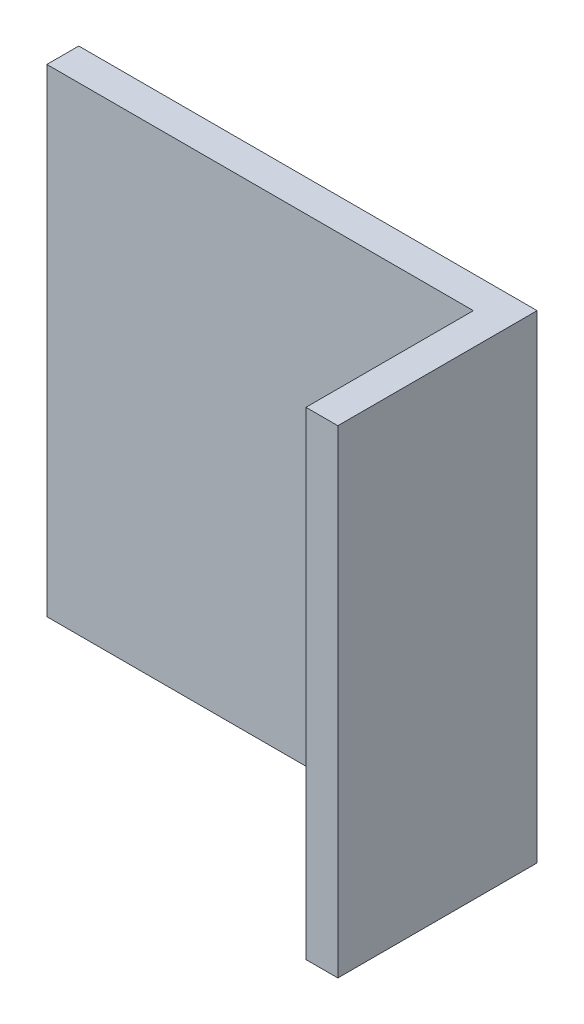
ISO-10303-21;
HEADER;
FILE_DESCRIPTION(('STEP AP214'),'2;1');
FILE_NAME('part.step','',(''),(''),'','','');
FILE_SCHEMA(('AUTOMOTIVE_DESIGN { 1 0 10303 214 1 1 1 1 }'));
ENDSEC;
DATA;
#1=APPLICATION_CONTEXT('core data for automotive mechanical design processes');
#2=APPLICATION_PROTOCOL_DEFINITION('international standard','automotive_design',2000,#1);
#3=PRODUCT_CONTEXT('',#1,'mechanical');
#4=PRODUCT('Part','Part','',(#3));
#5=PRODUCT_RELATED_PRODUCT_CATEGORY('part','',(#4));
#6=PRODUCT_DEFINITION_FORMATION('','',#4);
#7=PRODUCT_DEFINITION_CONTEXT('part definition',#1,'design');
#8=PRODUCT_DEFINITION('design','',#6,#7);
#9=PRODUCT_DEFINITION_SHAPE('','',#8);
#10=(LENGTH_UNIT() NAMED_UNIT(*) SI_UNIT(.MILLI.,.METRE.));
#11=(NAMED_UNIT(*) PLANE_ANGLE_UNIT() SI_UNIT($,.RADIAN.));
#12=(NAMED_UNIT(*) SI_UNIT($,.STERADIAN.) SOLID_ANGLE_UNIT());
#13=UNCERTAINTY_MEASURE_WITH_UNIT(LENGTH_MEASURE(1.E-05),#10,'distance_accuracy_value','');
#14=(GEOMETRIC_REPRESENTATION_CONTEXT(3) GLOBAL_UNCERTAINTY_ASSIGNED_CONTEXT((#13)) GLOBAL_UNIT_ASSIGNED_CONTEXT((#10,
#11,#12)) REPRESENTATION_CONTEXT('',''));
#15=CARTESIAN_POINT('',(0.,0.,0.));
#16=DIRECTION('',(0.,0.,1.));
#17=DIRECTION('',(1.,0.,0.));
#18=AXIS2_PLACEMENT_3D('',#15,#16,#17);
#19=CARTESIAN_POINT('',(-115.,-120.,16.));
#20=DIRECTION('',(1.,0.,0.));
#21=DIRECTION('',(0.,0.,-1.));
#22=AXIS2_PLACEMENT_3D('',#19,#20,#21);
#23=PLANE('',#22);
#24=DIRECTION('',(0.,-1.,0.));
#25=VECTOR('',#24,1.);
#26=CARTESIAN_POINT('',(-115.,-120.,0.));
#27=LINE('',#26,#25);
#28=CARTESIAN_POINT('',(-115.,120.,0.));
#29=VERTEX_POINT('',#28);
#30=CARTESIAN_POINT('',(-115.,-120.,0.));
#31=VERTEX_POINT('',#30);
#32=EDGE_CURVE('E94',#29,#31,#27,.T.);
#33=ORIENTED_EDGE('',*,*,#32,.T.);
#34=DIRECTION('',(0.,0.,-1.));
#35=VECTOR('',#34,1.);
#36=CARTESIAN_POINT('',(-115.,-120.,16.));
#37=LINE('',#36,#35);
#38=CARTESIAN_POINT('',(-115.,-120.,16.));
#39=VERTEX_POINT('',#38);
#40=EDGE_CURVE('E11',#39,#31,#37,.T.);
#41=ORIENTED_EDGE('',*,*,#40,.F.);
#42=DIRECTION('',(0.,-1.,0.));
#43=VECTOR('',#42,1.);
#44=CARTESIAN_POINT('',(-115.,-120.,16.));
#45=LINE('',#44,#43);
#46=CARTESIAN_POINT('',(-115.,120.,16.));
#47=VERTEX_POINT('',#46);
#48=EDGE_CURVE('E88',#47,#39,#45,.T.);
#49=ORIENTED_EDGE('',*,*,#48,.F.);
#50=DIRECTION('',(0.,0.,-1.));
#51=VECTOR('',#50,1.);
#52=CARTESIAN_POINT('',(-115.,120.,16.));
#53=LINE('',#52,#51);
#54=EDGE_CURVE('E79',#47,#29,#53,.T.);
#55=ORIENTED_EDGE('',*,*,#54,.T.);
#56=EDGE_LOOP('',(#33,#41,#49,#55));
#57=FACE_BOUND('',#56,.T.);
#58=ADVANCED_FACE('F36',(#57),#23,.F.);
#59=CARTESIAN_POINT('',(115.,-120.,16.));
#60=DIRECTION('',(0.,1.,0.));
#61=DIRECTION('',(-1.,0.,0.));
#62=AXIS2_PLACEMENT_3D('',#59,#60,#61);
#63=PLANE('',#62);
#64=DIRECTION('',(1.,0.,0.));
#65=VECTOR('',#64,1.);
#66=CARTESIAN_POINT('',(115.,-120.,0.));
#67=LINE('',#66,#65);
#68=CARTESIAN_POINT('',(115.,-120.,0.));
#69=VERTEX_POINT('',#68);
#70=EDGE_CURVE('E98',#31,#69,#67,.T.);
#71=ORIENTED_EDGE('',*,*,#70,.T.);
#72=DIRECTION('',(0.,0.,-1.));
#73=VECTOR('',#72,1.);
#74=CARTESIAN_POINT('',(115.,-120.,16.));
#75=LINE('',#74,#73);
#76=CARTESIAN_POINT('',(115.,-120.,100.));
#77=VERTEX_POINT('',#76);
#78=EDGE_CURVE('E44',#77,#69,#75,.T.);
#79=ORIENTED_EDGE('',*,*,#78,.F.);
#80=DIRECTION('',(1.,0.,0.));
#81=VECTOR('',#80,1.);
#82=CARTESIAN_POINT('',(115.,-120.,100.));
#83=LINE('',#82,#81);
#84=CARTESIAN_POINT('',(99.,-120.,100.));
#85=VERTEX_POINT('',#84);
#86=EDGE_CURVE('E119',#85,#77,#83,.T.);
#87=ORIENTED_EDGE('',*,*,#86,.F.);
#88=DIRECTION('',(0.,0.,-1.));
#89=VECTOR('',#88,1.);
#90=CARTESIAN_POINT('',(99.,-120.,100.));
#91=LINE('',#90,#89);
#92=CARTESIAN_POINT('',(99.,-120.,16.));
#93=VERTEX_POINT('',#92);
#94=EDGE_CURVE('E103',#85,#93,#91,.T.);
#95=ORIENTED_EDGE('',*,*,#94,.T.);
#96=DIRECTION('',(1.,0.,0.));
#97=VECTOR('',#96,1.);
#98=CARTESIAN_POINT('',(115.,-120.,16.));
#99=LINE('',#98,#97);
#100=EDGE_CURVE('E111',#39,#93,#99,.T.);
#101=ORIENTED_EDGE('',*,*,#100,.F.);
#102=ORIENTED_EDGE('',*,*,#40,.T.);
#103=EDGE_LOOP('',(#71,#79,#87,#95,#101,#102));
#104=FACE_BOUND('',#103,.T.);
#105=ADVANCED_FACE('F156',(#104),#63,.F.);
#106=CARTESIAN_POINT('',(115.,-120.,16.));
#107=DIRECTION('',(-1.,0.,0.));
#108=DIRECTION('',(0.,0.,1.));
#109=AXIS2_PLACEMENT_3D('',#106,#107,#108);
#110=PLANE('',#109);
#111=DIRECTION('',(0.,1.,0.));
#112=VECTOR('',#111,1.);
#113=CARTESIAN_POINT('',(115.,-120.,0.));
#114=LINE('',#113,#112);
#115=CARTESIAN_POINT('',(115.,120.,0.));
#116=VERTEX_POINT('',#115);
#117=EDGE_CURVE('E89',#69,#116,#114,.T.);
#118=ORIENTED_EDGE('',*,*,#117,.T.);
#119=DIRECTION('',(0.,0.,-1.));
#120=VECTOR('',#119,1.);
#121=CARTESIAN_POINT('',(115.,120.,16.));
#122=LINE('',#121,#120);
#123=CARTESIAN_POINT('',(115.,120.,100.));
#124=VERTEX_POINT('',#123);
#125=EDGE_CURVE('E83',#124,#116,#122,.T.);
#126=ORIENTED_EDGE('',*,*,#125,.F.);
#127=DIRECTION('',(0.,1.,0.));
#128=VECTOR('',#127,1.);
#129=CARTESIAN_POINT('',(115.,-120.,100.));
#130=LINE('',#129,#128);
#131=EDGE_CURVE('E122',#77,#124,#130,.T.);
#132=ORIENTED_EDGE('',*,*,#131,.F.);
#133=ORIENTED_EDGE('',*,*,#78,.T.);
#134=EDGE_LOOP('',(#118,#126,#132,#133));
#135=FACE_BOUND('',#134,.T.);
#136=ADVANCED_FACE('F148',(#135),#110,.F.);
#137=CARTESIAN_POINT('',(115.,120.,16.));
#138=DIRECTION('',(0.,-1.,0.));
#139=DIRECTION('',(1.,0.,0.));
#140=AXIS2_PLACEMENT_3D('',#137,#138,#139);
#141=PLANE('',#140);
#142=DIRECTION('',(-1.,0.,0.));
#143=VECTOR('',#142,1.);
#144=CARTESIAN_POINT('',(115.,120.,16.));
#145=LINE('',#144,#143);
#146=CARTESIAN_POINT('',(99.,120.,16.));
#147=VERTEX_POINT('',#146);
#148=EDGE_CURVE('E57',#147,#47,#145,.T.);
#149=ORIENTED_EDGE('',*,*,#148,.F.);
#150=DIRECTION('',(0.,0.,-1.));
#151=VECTOR('',#150,1.);
#152=CARTESIAN_POINT('',(99.,120.,100.));
#153=LINE('',#152,#151);
#154=CARTESIAN_POINT('',(99.,120.,100.));
#155=VERTEX_POINT('',#154);
#156=EDGE_CURVE('E99',#155,#147,#153,.T.);
#157=ORIENTED_EDGE('',*,*,#156,.F.);
#158=DIRECTION('',(-1.,0.,0.));
#159=VECTOR('',#158,1.);
#160=CARTESIAN_POINT('',(115.,120.,100.));
#161=LINE('',#160,#159);
#162=EDGE_CURVE('E136',#124,#155,#161,.T.);
#163=ORIENTED_EDGE('',*,*,#162,.F.);
#164=ORIENTED_EDGE('',*,*,#125,.T.);
#165=DIRECTION('',(-1.,0.,0.));
#166=VECTOR('',#165,1.);
#167=CARTESIAN_POINT('',(115.,120.,0.));
#168=LINE('',#167,#166);
#169=EDGE_CURVE('E76',#116,#29,#168,.T.);
#170=ORIENTED_EDGE('',*,*,#169,.T.);
#171=ORIENTED_EDGE('',*,*,#54,.F.);
#172=EDGE_LOOP('',(#149,#157,#163,#164,#170,#171));
#173=FACE_BOUND('',#172,.T.);
#174=ADVANCED_FACE('F78',(#173),#141,.F.);
#175=CARTESIAN_POINT('',(-115.,120.,16.));
#176=DIRECTION('',(0.,0.,1.));
#177=DIRECTION('',(1.,0.,0.));
#178=AXIS2_PLACEMENT_3D('',#175,#176,#177);
#179=PLANE('',#178);
#180=DIRECTION('',(0.,-1.,0.));
#181=VECTOR('',#180,1.);
#182=CARTESIAN_POINT('',(99.,-120.,16.));
#183=LINE('',#182,#181);
#184=EDGE_CURVE('E52',#147,#93,#183,.T.);
#185=ORIENTED_EDGE('',*,*,#184,.F.);
#186=ORIENTED_EDGE('',*,*,#148,.T.);
#187=ORIENTED_EDGE('',*,*,#48,.T.);
#188=ORIENTED_EDGE('',*,*,#100,.T.);
#189=EDGE_LOOP('',(#185,#186,#187,#188));
#190=FACE_BOUND('',#189,.T.);
#191=ADVANCED_FACE('F153',(#190),#179,.T.);
#192=CARTESIAN_POINT('',(-115.,120.,0.));
#193=DIRECTION('',(0.,0.,1.));
#194=DIRECTION('',(1.,0.,0.));
#195=AXIS2_PLACEMENT_3D('',#192,#193,#194);
#196=PLANE('',#195);
#197=ORIENTED_EDGE('',*,*,#117,.F.);
#198=ORIENTED_EDGE('',*,*,#70,.F.);
#199=ORIENTED_EDGE('',*,*,#32,.F.);
#200=ORIENTED_EDGE('',*,*,#169,.F.);
#201=EDGE_LOOP('',(#197,#198,#199,#200));
#202=FACE_BOUND('',#201,.T.);
#203=ADVANCED_FACE('F96',(#202),#196,.F.);
#204=CARTESIAN_POINT('',(99.,-120.,100.));
#205=DIRECTION('',(1.,0.,0.));
#206=DIRECTION('',(0.,0.,-1.));
#207=AXIS2_PLACEMENT_3D('',#204,#205,#206);
#208=PLANE('',#207);
#209=ORIENTED_EDGE('',*,*,#184,.T.);
#210=ORIENTED_EDGE('',*,*,#94,.F.);
#211=DIRECTION('',(0.,-1.,0.));
#212=VECTOR('',#211,1.);
#213=CARTESIAN_POINT('',(99.,-120.,100.));
#214=LINE('',#213,#212);
#215=EDGE_CURVE('E131',#155,#85,#214,.T.);
#216=ORIENTED_EDGE('',*,*,#215,.F.);
#217=ORIENTED_EDGE('',*,*,#156,.T.);
#218=EDGE_LOOP('',(#209,#210,#216,#217));
#219=FACE_BOUND('',#218,.T.);
#220=ADVANCED_FACE('F155',(#219),#208,.F.);
#221=CARTESIAN_POINT('',(115.,120.,100.));
#222=DIRECTION('',(0.,0.,1.));
#223=DIRECTION('',(1.,0.,0.));
#224=AXIS2_PLACEMENT_3D('',#221,#222,#223);
#225=PLANE('',#224);
#226=ORIENTED_EDGE('',*,*,#131,.T.);
#227=ORIENTED_EDGE('',*,*,#162,.T.);
#228=ORIENTED_EDGE('',*,*,#215,.T.);
#229=ORIENTED_EDGE('',*,*,#86,.T.);
#230=EDGE_LOOP('',(#226,#227,#228,#229));
#231=FACE_BOUND('',#230,.T.);
#232=ADVANCED_FACE('F143',(#231),#225,.T.);
#233=CLOSED_SHELL('',(#58,#105,#136,#174,#191,#203,#220,#232));
#234=MANIFOLD_SOLID_BREP('B2',#233);
#235=ADVANCED_BREP_SHAPE_REPRESENTATION('',(#18,#234),#14);
#236=SHAPE_DEFINITION_REPRESENTATION(#9,#235);
ENDSEC;
END-ISO-10303-21;
